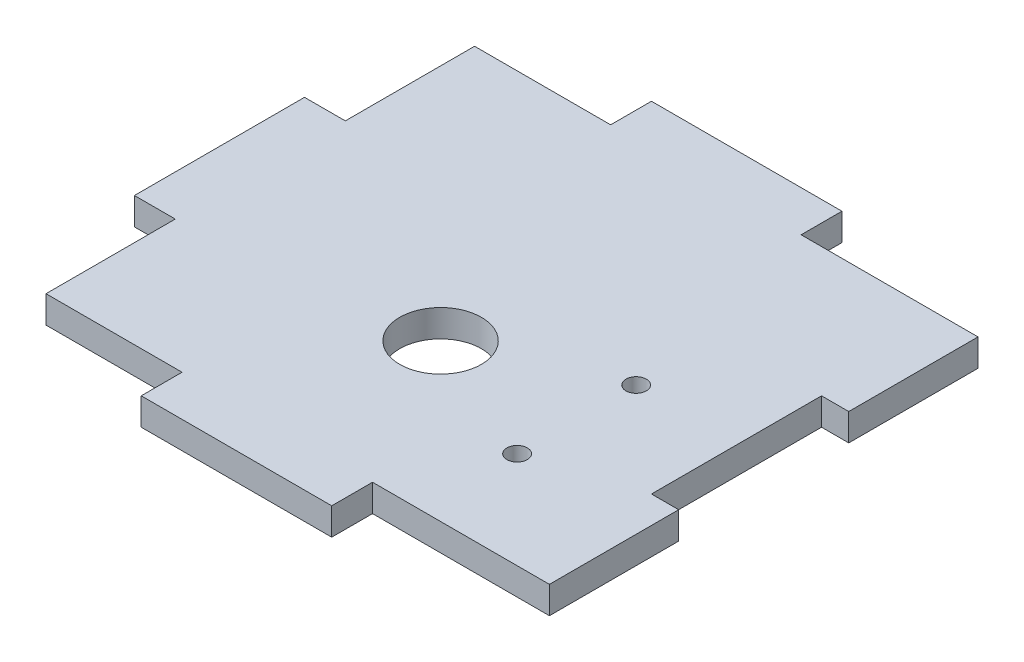
ISO-10303-21;
HEADER;
FILE_DESCRIPTION(('STEP AP214'),'2;1');
FILE_NAME('part.step','',(''),(''),'','','');
FILE_SCHEMA(('AUTOMOTIVE_DESIGN { 1 0 10303 214 1 1 1 1 }'));
ENDSEC;
DATA;
#1=APPLICATION_CONTEXT('core data for automotive mechanical design processes');
#2=APPLICATION_PROTOCOL_DEFINITION('international standard','automotive_design',2000,#1);
#3=PRODUCT_CONTEXT('',#1,'mechanical');
#4=PRODUCT('Part','Part','',(#3));
#5=PRODUCT_RELATED_PRODUCT_CATEGORY('part','',(#4));
#6=PRODUCT_DEFINITION_FORMATION('','',#4);
#7=PRODUCT_DEFINITION_CONTEXT('part definition',#1,'design');
#8=PRODUCT_DEFINITION('design','',#6,#7);
#9=PRODUCT_DEFINITION_SHAPE('','',#8);
#10=(LENGTH_UNIT() NAMED_UNIT(*) SI_UNIT(.MILLI.,.METRE.));
#11=(NAMED_UNIT(*) PLANE_ANGLE_UNIT() SI_UNIT($,.RADIAN.));
#12=(NAMED_UNIT(*) SI_UNIT($,.STERADIAN.) SOLID_ANGLE_UNIT());
#13=UNCERTAINTY_MEASURE_WITH_UNIT(LENGTH_MEASURE(1.E-05),#10,'distance_accuracy_value','');
#14=(GEOMETRIC_REPRESENTATION_CONTEXT(3) GLOBAL_UNCERTAINTY_ASSIGNED_CONTEXT((#13)) GLOBAL_UNIT_ASSIGNED_CONTEXT((#10,
#11,#12)) REPRESENTATION_CONTEXT('',''));
#15=CARTESIAN_POINT('',(0.,0.,0.));
#16=DIRECTION('',(0.,0.,1.));
#17=DIRECTION('',(1.,0.,0.));
#18=AXIS2_PLACEMENT_3D('',#15,#16,#17);
#19=CARTESIAN_POINT('',(0.,4.,0.));
#20=DIRECTION('',(1.,0.,0.));
#21=DIRECTION('',(0.,0.,-1.));
#22=AXIS2_PLACEMENT_3D('',#19,#20,#21);
#23=PLANE('',#22);
#24=DIRECTION('',(0.,1.,0.));
#25=VECTOR('',#24,1.);
#26=CARTESIAN_POINT('',(0.,0.,-25.));
#27=LINE('',#26,#25);
#28=CARTESIAN_POINT('',(0.,0.,-25.));
#29=VERTEX_POINT('',#28);
#30=CARTESIAN_POINT('',(0.,4.,-25.));
#31=VERTEX_POINT('',#30);
#32=EDGE_CURVE('E315',#29,#31,#27,.T.);
#33=ORIENTED_EDGE('',*,*,#32,.T.);
#34=DIRECTION('',(0.,0.,1.));
#35=VECTOR('',#34,1.);
#36=CARTESIAN_POINT('',(0.,4.,0.));
#37=LINE('',#36,#35);
#38=CARTESIAN_POINT('',(0.,4.,-50.));
#39=VERTEX_POINT('',#38);
#40=EDGE_CURVE('E235',#39,#31,#37,.T.);
#41=ORIENTED_EDGE('',*,*,#40,.F.);
#42=DIRECTION('',(0.,1.,0.));
#43=VECTOR('',#42,1.);
#44=CARTESIAN_POINT('',(0.,0.,-50.));
#45=LINE('',#44,#43);
#46=CARTESIAN_POINT('',(0.,0.,-50.));
#47=VERTEX_POINT('',#46);
#48=EDGE_CURVE('E374',#47,#39,#45,.T.);
#49=ORIENTED_EDGE('',*,*,#48,.F.);
#50=DIRECTION('',(0.,0.,1.));
#51=VECTOR('',#50,1.);
#52=CARTESIAN_POINT('',(0.,0.,0.));
#53=LINE('',#52,#51);
#54=EDGE_CURVE('E216',#47,#29,#53,.T.);
#55=ORIENTED_EDGE('',*,*,#54,.T.);
#56=EDGE_LOOP('',(#33,#41,#49,#55));
#57=FACE_BOUND('',#56,.T.);
#58=ADVANCED_FACE('F39',(#57),#23,.F.);
#59=CARTESIAN_POINT('',(0.,4.,0.));
#60=DIRECTION('',(0.,0.,-1.));
#61=DIRECTION('',(-1.,0.,0.));
#62=AXIS2_PLACEMENT_3D('',#59,#60,#61);
#63=PLANE('',#62);
#64=DIRECTION('',(1.,0.,0.));
#65=VECTOR('',#64,1.);
#66=CARTESIAN_POINT('',(0.,4.,0.));
#67=LINE('',#66,#65);
#68=CARTESIAN_POINT('',(26.,4.,0.));
#69=VERTEX_POINT('',#68);
#70=CARTESIAN_POINT('',(54.,4.,0.));
#71=VERTEX_POINT('',#70);
#72=EDGE_CURVE('E212',#69,#71,#67,.T.);
#73=ORIENTED_EDGE('',*,*,#72,.F.);
#74=DIRECTION('',(0.,1.,0.));
#75=VECTOR('',#74,1.);
#76=CARTESIAN_POINT('',(26.,0.,0.));
#77=LINE('',#76,#75);
#78=CARTESIAN_POINT('',(26.,0.,0.));
#79=VERTEX_POINT('',#78);
#80=EDGE_CURVE('E355',#79,#69,#77,.T.);
#81=ORIENTED_EDGE('',*,*,#80,.F.);
#82=DIRECTION('',(1.,0.,0.));
#83=VECTOR('',#82,1.);
#84=CARTESIAN_POINT('',(0.,0.,0.));
#85=LINE('',#84,#83);
#86=CARTESIAN_POINT('',(54.,0.,0.));
#87=VERTEX_POINT('',#86);
#88=EDGE_CURVE('E220',#79,#87,#85,.T.);
#89=ORIENTED_EDGE('',*,*,#88,.T.);
#90=DIRECTION('',(0.,1.,0.));
#91=VECTOR('',#90,1.);
#92=CARTESIAN_POINT('',(54.,0.,0.));
#93=LINE('',#92,#91);
#94=EDGE_CURVE('E192',#87,#71,#93,.T.);
#95=ORIENTED_EDGE('',*,*,#94,.T.);
#96=EDGE_LOOP('',(#73,#81,#89,#95));
#97=FACE_BOUND('',#96,.T.);
#98=ADVANCED_FACE('F489',(#97),#63,.F.);
#99=CARTESIAN_POINT('',(80.,4.,0.));
#100=DIRECTION('',(-1.,0.,0.));
#101=DIRECTION('',(0.,0.,1.));
#102=AXIS2_PLACEMENT_3D('',#99,#100,#101);
#103=PLANE('',#102);
#104=DIRECTION('',(0.,1.,0.));
#105=VECTOR('',#104,1.);
#106=CARTESIAN_POINT('',(80.,0.,-69.));
#107=LINE('',#106,#105);
#108=CARTESIAN_POINT('',(80.,0.,-69.));
#109=VERTEX_POINT('',#108);
#110=CARTESIAN_POINT('',(80.,4.,-69.));
#111=VERTEX_POINT('',#110);
#112=EDGE_CURVE('E310',#109,#111,#107,.T.);
#113=ORIENTED_EDGE('',*,*,#112,.T.);
#114=DIRECTION('',(0.,0.,-1.));
#115=VECTOR('',#114,1.);
#116=CARTESIAN_POINT('',(80.,4.,0.));
#117=LINE('',#116,#115);
#118=CARTESIAN_POINT('',(80.,4.,-50.));
#119=VERTEX_POINT('',#118);
#120=EDGE_CURVE('E208',#119,#111,#117,.T.);
#121=ORIENTED_EDGE('',*,*,#120,.F.);
#122=DIRECTION('',(0.,1.,0.));
#123=VECTOR('',#122,1.);
#124=CARTESIAN_POINT('',(80.,0.,-50.));
#125=LINE('',#124,#123);
#126=CARTESIAN_POINT('',(80.,0.,-50.));
#127=VERTEX_POINT('',#126);
#128=EDGE_CURVE('E276',#127,#119,#125,.T.);
#129=ORIENTED_EDGE('',*,*,#128,.F.);
#130=DIRECTION('',(0.,0.,-1.));
#131=VECTOR('',#130,1.);
#132=CARTESIAN_POINT('',(80.,0.,0.));
#133=LINE('',#132,#131);
#134=EDGE_CURVE('E224',#127,#109,#133,.T.);
#135=ORIENTED_EDGE('',*,*,#134,.T.);
#136=EDGE_LOOP('',(#113,#121,#129,#135));
#137=FACE_BOUND('',#136,.T.);
#138=ADVANCED_FACE('F441',(#137),#103,.F.);
#139=CARTESIAN_POINT('',(80.,4.,-6.00000000000001));
#140=VERTEX_POINT('',#139);
#141=CARTESIAN_POINT('',(80.,4.,-25.));
#142=VERTEX_POINT('',#141);
#143=EDGE_CURVE('E48',#140,#142,#117,.T.);
#144=ORIENTED_EDGE('',*,*,#143,.F.);
#145=DIRECTION('',(0.,1.,0.));
#146=VECTOR('',#145,1.);
#147=CARTESIAN_POINT('',(80.,0.,-6.00000000000001));
#148=LINE('',#147,#146);
#149=CARTESIAN_POINT('',(80.,0.,-6.00000000000001));
#150=VERTEX_POINT('',#149);
#151=EDGE_CURVE('E179',#150,#140,#148,.T.);
#152=ORIENTED_EDGE('',*,*,#151,.F.);
#153=CARTESIAN_POINT('',(80.,0.,-25.));
#154=VERTEX_POINT('',#153);
#155=EDGE_CURVE('E227',#150,#154,#133,.T.);
#156=ORIENTED_EDGE('',*,*,#155,.T.);
#157=DIRECTION('',(0.,1.,0.));
#158=VECTOR('',#157,1.);
#159=CARTESIAN_POINT('',(80.,0.,-25.));
#160=LINE('',#159,#158);
#161=EDGE_CURVE('E206',#154,#142,#160,.T.);
#162=ORIENTED_EDGE('',*,*,#161,.T.);
#163=EDGE_LOOP('',(#144,#152,#156,#162));
#164=FACE_BOUND('',#163,.T.);
#165=ADVANCED_FACE('F205',(#164),#103,.F.);
#166=CARTESIAN_POINT('',(0.,4.,-75.));
#167=DIRECTION('',(0.,0.,1.));
#168=DIRECTION('',(1.,0.,0.));
#169=AXIS2_PLACEMENT_3D('',#166,#167,#168);
#170=PLANE('',#169);
#171=DIRECTION('',(-1.,0.,0.));
#172=VECTOR('',#171,1.);
#173=CARTESIAN_POINT('',(0.,4.,-75.));
#174=LINE('',#173,#172);
#175=CARTESIAN_POINT('',(54.,4.,-75.));
#176=VERTEX_POINT('',#175);
#177=CARTESIAN_POINT('',(26.,4.,-75.));
#178=VERTEX_POINT('',#177);
#179=EDGE_CURVE('E11',#176,#178,#174,.T.);
#180=ORIENTED_EDGE('',*,*,#179,.F.);
#181=DIRECTION('',(0.,1.,0.));
#182=VECTOR('',#181,1.);
#183=CARTESIAN_POINT('',(54.,0.,-75.));
#184=LINE('',#183,#182);
#185=CARTESIAN_POINT('',(54.,0.,-75.));
#186=VERTEX_POINT('',#185);
#187=EDGE_CURVE('E320',#186,#176,#184,.T.);
#188=ORIENTED_EDGE('',*,*,#187,.F.);
#189=DIRECTION('',(-1.,0.,0.));
#190=VECTOR('',#189,1.);
#191=CARTESIAN_POINT('',(0.,0.,-75.));
#192=LINE('',#191,#190);
#193=CARTESIAN_POINT('',(26.,0.,-75.));
#194=VERTEX_POINT('',#193);
#195=EDGE_CURVE('E42',#186,#194,#192,.T.);
#196=ORIENTED_EDGE('',*,*,#195,.T.);
#197=DIRECTION('',(0.,1.,0.));
#198=VECTOR('',#197,1.);
#199=CARTESIAN_POINT('',(26.,0.,-75.));
#200=LINE('',#199,#198);
#201=EDGE_CURVE('E379',#194,#178,#200,.T.);
#202=ORIENTED_EDGE('',*,*,#201,.T.);
#203=EDGE_LOOP('',(#180,#188,#196,#202));
#204=FACE_BOUND('',#203,.T.);
#205=ADVANCED_FACE('F449',(#204),#170,.F.);
#206=CARTESIAN_POINT('',(0.,4.,0.));
#207=DIRECTION('',(0.,-1.,0.));
#208=DIRECTION('',(0.,0.,-1.));
#209=AXIS2_PLACEMENT_3D('',#206,#207,#208);
#210=PLANE('',#209);
#211=CARTESIAN_POINT('',(41.,4.,-29.));
#212=DIRECTION('',(0.,1.,0.));
#213=DIRECTION('',(0.,0.,1.));
#214=AXIS2_PLACEMENT_3D('',#211,#212,#213);
#215=CIRCLE('',#214,6.);
#216=CARTESIAN_POINT('',(41.,4.,-23.));
#217=VERTEX_POINT('',#216);
#218=EDGE_CURVE('E263',#217,#217,#215,.T.);
#219=ORIENTED_EDGE('',*,*,#218,.F.);
#220=EDGE_LOOP('',(#219));
#221=FACE_BOUND('',#220,.T.);
#222=CARTESIAN_POINT('',(61.,4.,-37.75));
#223=DIRECTION('',(0.,1.,0.));
#224=DIRECTION('',(0.,0.,1.));
#225=AXIS2_PLACEMENT_3D('',#222,#223,#224);
#226=CIRCLE('',#225,1.5);
#227=CARTESIAN_POINT('',(61.,4.,-36.25));
#228=VERTEX_POINT('',#227);
#229=EDGE_CURVE('E255',#228,#228,#226,.T.);
#230=ORIENTED_EDGE('',*,*,#229,.F.);
#231=EDGE_LOOP('',(#230));
#232=FACE_BOUND('',#231,.T.);
#233=CARTESIAN_POINT('',(61.,4.,-20.25));
#234=DIRECTION('',(0.,1.,0.));
#235=DIRECTION('',(0.,0.,1.));
#236=AXIS2_PLACEMENT_3D('',#233,#234,#235);
#237=CIRCLE('',#236,1.5);
#238=CARTESIAN_POINT('',(61.,4.,-18.75));
#239=VERTEX_POINT('',#238);
#240=EDGE_CURVE('E246',#239,#239,#237,.T.);
#241=ORIENTED_EDGE('',*,*,#240,.F.);
#242=EDGE_LOOP('',(#241));
#243=FACE_BOUND('',#242,.T.);
#244=DIRECTION('',(1.,0.,0.));
#245=VECTOR('',#244,1.);
#246=CARTESIAN_POINT('',(0.,4.,-25.));
#247=LINE('',#246,#245);
#248=CARTESIAN_POINT('',(6.00000000000001,4.,-25.));
#249=VERTEX_POINT('',#248);
#250=EDGE_CURVE('E327',#31,#249,#247,.T.);
#251=ORIENTED_EDGE('',*,*,#250,.T.);
#252=DIRECTION('',(0.,0.,1.));
#253=VECTOR('',#252,1.);
#254=CARTESIAN_POINT('',(6.00000000000001,4.,0.));
#255=LINE('',#254,#253);
#256=CARTESIAN_POINT('',(6.00000000000001,4.,-6.));
#257=VERTEX_POINT('',#256);
#258=EDGE_CURVE('E332',#249,#257,#255,.T.);
#259=ORIENTED_EDGE('',*,*,#258,.T.);
#260=DIRECTION('',(1.,0.,0.));
#261=VECTOR('',#260,1.);
#262=CARTESIAN_POINT('',(0.,4.,-6.));
#263=LINE('',#262,#261);
#264=CARTESIAN_POINT('',(26.,4.,-6.));
#265=VERTEX_POINT('',#264);
#266=EDGE_CURVE('E293',#257,#265,#263,.T.);
#267=ORIENTED_EDGE('',*,*,#266,.T.);
#268=DIRECTION('',(0.,0.,-1.));
#269=VECTOR('',#268,1.);
#270=CARTESIAN_POINT('',(26.,4.,0.));
#271=LINE('',#270,#269);
#272=EDGE_CURVE('E350',#69,#265,#271,.T.);
#273=ORIENTED_EDGE('',*,*,#272,.F.);
#274=ORIENTED_EDGE('',*,*,#72,.T.);
#275=DIRECTION('',(0.,0.,-1.));
#276=VECTOR('',#275,1.);
#277=CARTESIAN_POINT('',(54.,4.,0.));
#278=LINE('',#277,#276);
#279=CARTESIAN_POINT('',(54.,4.,-6.00000000000001));
#280=VERTEX_POINT('',#279);
#281=EDGE_CURVE('E201',#71,#280,#278,.T.);
#282=ORIENTED_EDGE('',*,*,#281,.T.);
#283=DIRECTION('',(-1.,0.,0.));
#284=VECTOR('',#283,1.);
#285=CARTESIAN_POINT('',(80.,4.,-6.00000000000001));
#286=LINE('',#285,#284);
#287=EDGE_CURVE('E183',#140,#280,#286,.T.);
#288=ORIENTED_EDGE('',*,*,#287,.F.);
#289=ORIENTED_EDGE('',*,*,#143,.T.);
#290=DIRECTION('',(-1.,0.,0.));
#291=VECTOR('',#290,1.);
#292=CARTESIAN_POINT('',(0.,4.,-25.));
#293=LINE('',#292,#291);
#294=CARTESIAN_POINT('',(76.,4.,-25.));
#295=VERTEX_POINT('',#294);
#296=EDGE_CURVE('E286',#142,#295,#293,.T.);
#297=ORIENTED_EDGE('',*,*,#296,.T.);
#298=DIRECTION('',(0.,0.,-1.));
#299=VECTOR('',#298,1.);
#300=CARTESIAN_POINT('',(76.,4.,0.));
#301=LINE('',#300,#299);
#302=CARTESIAN_POINT('',(76.,4.,-50.));
#303=VERTEX_POINT('',#302);
#304=EDGE_CURVE('E289',#295,#303,#301,.T.);
#305=ORIENTED_EDGE('',*,*,#304,.T.);
#306=DIRECTION('',(-1.,0.,0.));
#307=VECTOR('',#306,1.);
#308=CARTESIAN_POINT('',(0.,4.,-50.));
#309=LINE('',#308,#307);
#310=EDGE_CURVE('E281',#119,#303,#309,.T.);
#311=ORIENTED_EDGE('',*,*,#310,.F.);
#312=ORIENTED_EDGE('',*,*,#120,.T.);
#313=DIRECTION('',(-1.,0.,0.));
#314=VECTOR('',#313,1.);
#315=CARTESIAN_POINT('',(80.,4.,-69.));
#316=LINE('',#315,#314);
#317=CARTESIAN_POINT('',(54.,4.,-69.));
#318=VERTEX_POINT('',#317);
#319=EDGE_CURVE('E311',#111,#318,#316,.T.);
#320=ORIENTED_EDGE('',*,*,#319,.T.);
#321=DIRECTION('',(0.,0.,1.));
#322=VECTOR('',#321,1.);
#323=CARTESIAN_POINT('',(54.,4.,-75.));
#324=LINE('',#323,#322);
#325=EDGE_CURVE('E305',#176,#318,#324,.T.);
#326=ORIENTED_EDGE('',*,*,#325,.F.);
#327=ORIENTED_EDGE('',*,*,#179,.T.);
#328=DIRECTION('',(0.,0.,1.));
#329=VECTOR('',#328,1.);
#330=CARTESIAN_POINT('',(26.,4.,-75.));
#331=LINE('',#330,#329);
#332=CARTESIAN_POINT('',(26.,4.,-69.));
#333=VERTEX_POINT('',#332);
#334=EDGE_CURVE('E395',#178,#333,#331,.T.);
#335=ORIENTED_EDGE('',*,*,#334,.T.);
#336=DIRECTION('',(1.,0.,0.));
#337=VECTOR('',#336,1.);
#338=CARTESIAN_POINT('',(0.,4.,-69.));
#339=LINE('',#338,#337);
#340=CARTESIAN_POINT('',(6.,4.,-69.));
#341=VERTEX_POINT('',#340);
#342=EDGE_CURVE('E193',#341,#333,#339,.T.);
#343=ORIENTED_EDGE('',*,*,#342,.F.);
#344=DIRECTION('',(0.,0.,1.));
#345=VECTOR('',#344,1.);
#346=CARTESIAN_POINT('',(6.00000000000001,4.,0.));
#347=LINE('',#346,#345);
#348=CARTESIAN_POINT('',(6.,4.,-50.));
#349=VERTEX_POINT('',#348);
#350=EDGE_CURVE('E370',#341,#349,#347,.T.);
#351=ORIENTED_EDGE('',*,*,#350,.T.);
#352=DIRECTION('',(1.,0.,0.));
#353=VECTOR('',#352,1.);
#354=CARTESIAN_POINT('',(0.,4.,-50.));
#355=LINE('',#354,#353);
#356=EDGE_CURVE('E375',#39,#349,#355,.T.);
#357=ORIENTED_EDGE('',*,*,#356,.F.);
#358=ORIENTED_EDGE('',*,*,#40,.T.);
#359=EDGE_LOOP('',(#251,#259,#267,#273,#274,#282,#288,#289,#297,#305,#311,#312,#320,#326,#327,
#335,#343,#351,#357,#358));
#360=FACE_BOUND('',#359,.T.);
#361=ADVANCED_FACE('F198',(#221,#232,#243,#360),#210,.F.);
#362=CARTESIAN_POINT('',(0.,0.,0.));
#363=DIRECTION('',(0.,-1.,0.));
#364=DIRECTION('',(0.,0.,-1.));
#365=AXIS2_PLACEMENT_3D('',#362,#363,#364);
#366=PLANE('',#365);
#367=CARTESIAN_POINT('',(41.,0.,-29.));
#368=DIRECTION('',(0.,1.,0.));
#369=DIRECTION('',(0.,0.,1.));
#370=AXIS2_PLACEMENT_3D('',#367,#368,#369);
#371=CIRCLE('',#370,6.);
#372=CARTESIAN_POINT('',(41.,0.,-23.));
#373=VERTEX_POINT('',#372);
#374=EDGE_CURVE('E221',#373,#373,#371,.T.);
#375=ORIENTED_EDGE('',*,*,#374,.T.);
#376=EDGE_LOOP('',(#375));
#377=FACE_BOUND('',#376,.T.);
#378=CARTESIAN_POINT('',(61.,0.,-37.75));
#379=DIRECTION('',(0.,1.,0.));
#380=DIRECTION('',(0.,0.,1.));
#381=AXIS2_PLACEMENT_3D('',#378,#379,#380);
#382=CIRCLE('',#381,1.5);
#383=CARTESIAN_POINT('',(61.,0.,-36.25));
#384=VERTEX_POINT('',#383);
#385=EDGE_CURVE('E259',#384,#384,#382,.T.);
#386=ORIENTED_EDGE('',*,*,#385,.T.);
#387=EDGE_LOOP('',(#386));
#388=FACE_BOUND('',#387,.T.);
#389=CARTESIAN_POINT('',(61.,0.,-20.25));
#390=DIRECTION('',(0.,1.,0.));
#391=DIRECTION('',(0.,0.,1.));
#392=AXIS2_PLACEMENT_3D('',#389,#390,#391);
#393=CIRCLE('',#392,1.5);
#394=CARTESIAN_POINT('',(61.,0.,-18.75));
#395=VERTEX_POINT('',#394);
#396=EDGE_CURVE('E250',#395,#395,#393,.T.);
#397=ORIENTED_EDGE('',*,*,#396,.T.);
#398=EDGE_LOOP('',(#397));
#399=FACE_BOUND('',#398,.T.);
#400=DIRECTION('',(0.,0.,1.));
#401=VECTOR('',#400,1.);
#402=CARTESIAN_POINT('',(6.00000000000001,0.,0.));
#403=LINE('',#402,#401);
#404=CARTESIAN_POINT('',(6.00000000000001,0.,-25.));
#405=VERTEX_POINT('',#404);
#406=CARTESIAN_POINT('',(6.00000000000001,0.,-6.));
#407=VERTEX_POINT('',#406);
#408=EDGE_CURVE('E56',#405,#407,#403,.T.);
#409=ORIENTED_EDGE('',*,*,#408,.F.);
#410=DIRECTION('',(1.,0.,0.));
#411=VECTOR('',#410,1.);
#412=CARTESIAN_POINT('',(0.,0.,-25.));
#413=LINE('',#412,#411);
#414=EDGE_CURVE('E328',#29,#405,#413,.T.);
#415=ORIENTED_EDGE('',*,*,#414,.F.);
#416=ORIENTED_EDGE('',*,*,#54,.F.);
#417=DIRECTION('',(1.,0.,0.));
#418=VECTOR('',#417,1.);
#419=CARTESIAN_POINT('',(0.,0.,-50.));
#420=LINE('',#419,#418);
#421=CARTESIAN_POINT('',(6.,0.,-50.));
#422=VERTEX_POINT('',#421);
#423=EDGE_CURVE('E366',#47,#422,#420,.T.);
#424=ORIENTED_EDGE('',*,*,#423,.T.);
#425=DIRECTION('',(0.,0.,1.));
#426=VECTOR('',#425,1.);
#427=CARTESIAN_POINT('',(6.00000000000001,0.,0.));
#428=LINE('',#427,#426);
#429=CARTESIAN_POINT('',(6.,0.,-69.));
#430=VERTEX_POINT('',#429);
#431=EDGE_CURVE('E371',#430,#422,#428,.T.);
#432=ORIENTED_EDGE('',*,*,#431,.F.);
#433=DIRECTION('',(1.,0.,0.));
#434=VECTOR('',#433,1.);
#435=CARTESIAN_POINT('',(0.,0.,-69.));
#436=LINE('',#435,#434);
#437=CARTESIAN_POINT('',(26.,0.,-69.));
#438=VERTEX_POINT('',#437);
#439=EDGE_CURVE('E391',#430,#438,#436,.T.);
#440=ORIENTED_EDGE('',*,*,#439,.T.);
#441=DIRECTION('',(0.,0.,1.));
#442=VECTOR('',#441,1.);
#443=CARTESIAN_POINT('',(26.,0.,-75.));
#444=LINE('',#443,#442);
#445=EDGE_CURVE('E396',#194,#438,#444,.T.);
#446=ORIENTED_EDGE('',*,*,#445,.F.);
#447=ORIENTED_EDGE('',*,*,#195,.F.);
#448=DIRECTION('',(0.,0.,1.));
#449=VECTOR('',#448,1.);
#450=CARTESIAN_POINT('',(54.,0.,-75.));
#451=LINE('',#450,#449);
#452=CARTESIAN_POINT('',(54.,0.,-69.));
#453=VERTEX_POINT('',#452);
#454=EDGE_CURVE('E306',#186,#453,#451,.T.);
#455=ORIENTED_EDGE('',*,*,#454,.T.);
#456=DIRECTION('',(-1.,0.,0.));
#457=VECTOR('',#456,1.);
#458=CARTESIAN_POINT('',(80.,0.,-69.));
#459=LINE('',#458,#457);
#460=EDGE_CURVE('E302',#109,#453,#459,.T.);
#461=ORIENTED_EDGE('',*,*,#460,.F.);
#462=ORIENTED_EDGE('',*,*,#134,.F.);
#463=DIRECTION('',(-1.,0.,0.));
#464=VECTOR('',#463,1.);
#465=CARTESIAN_POINT('',(0.,0.,-50.));
#466=LINE('',#465,#464);
#467=CARTESIAN_POINT('',(76.,0.,-50.));
#468=VERTEX_POINT('',#467);
#469=EDGE_CURVE('E273',#127,#468,#466,.T.);
#470=ORIENTED_EDGE('',*,*,#469,.T.);
#471=DIRECTION('',(0.,0.,-1.));
#472=VECTOR('',#471,1.);
#473=CARTESIAN_POINT('',(76.,0.,0.));
#474=LINE('',#473,#472);
#475=CARTESIAN_POINT('',(76.,0.,-25.));
#476=VERTEX_POINT('',#475);
#477=EDGE_CURVE('E285',#476,#468,#474,.T.);
#478=ORIENTED_EDGE('',*,*,#477,.F.);
#479=DIRECTION('',(-1.,0.,0.));
#480=VECTOR('',#479,1.);
#481=CARTESIAN_POINT('',(0.,0.,-25.));
#482=LINE('',#481,#480);
#483=EDGE_CURVE('E297',#154,#476,#482,.T.);
#484=ORIENTED_EDGE('',*,*,#483,.F.);
#485=ORIENTED_EDGE('',*,*,#155,.F.);
#486=DIRECTION('',(-1.,0.,0.));
#487=VECTOR('',#486,1.);
#488=CARTESIAN_POINT('',(80.,0.,-6.00000000000001));
#489=LINE('',#488,#487);
#490=CARTESIAN_POINT('',(54.,0.,-6.00000000000001));
#491=VERTEX_POINT('',#490);
#492=EDGE_CURVE('E186',#150,#491,#489,.T.);
#493=ORIENTED_EDGE('',*,*,#492,.T.);
#494=DIRECTION('',(0.,0.,-1.));
#495=VECTOR('',#494,1.);
#496=CARTESIAN_POINT('',(54.,0.,0.));
#497=LINE('',#496,#495);
#498=EDGE_CURVE('E413',#87,#491,#497,.T.);
#499=ORIENTED_EDGE('',*,*,#498,.F.);
#500=ORIENTED_EDGE('',*,*,#88,.F.);
#501=DIRECTION('',(0.,0.,-1.));
#502=VECTOR('',#501,1.);
#503=CARTESIAN_POINT('',(26.,0.,0.));
#504=LINE('',#503,#502);
#505=CARTESIAN_POINT('',(26.,0.,-6.));
#506=VERTEX_POINT('',#505);
#507=EDGE_CURVE('E351',#79,#506,#504,.T.);
#508=ORIENTED_EDGE('',*,*,#507,.T.);
#509=DIRECTION('',(1.,0.,0.));
#510=VECTOR('',#509,1.);
#511=CARTESIAN_POINT('',(0.,0.,-6.));
#512=LINE('',#511,#510);
#513=EDGE_CURVE('E347',#407,#506,#512,.T.);
#514=ORIENTED_EDGE('',*,*,#513,.F.);
#515=EDGE_LOOP('',(#409,#415,#416,#424,#432,#440,#446,#447,#455,#461,#462,#470,#478,#484,#485,
#493,#499,#500,#508,#514));
#516=FACE_BOUND('',#515,.T.);
#517=ADVANCED_FACE('F427',(#377,#388,#399,#516),#366,.T.);
#518=CARTESIAN_POINT('',(61.,0.,-20.25));
#519=DIRECTION('',(0.,1.,0.));
#520=DIRECTION('',(0.,0.,1.));
#521=AXIS2_PLACEMENT_3D('',#518,#519,#520);
#522=CYLINDRICAL_SURFACE('',#521,1.5);
#523=ORIENTED_EDGE('',*,*,#396,.F.);
#524=EDGE_LOOP('',(#523));
#525=FACE_BOUND('',#524,.T.);
#526=ORIENTED_EDGE('',*,*,#240,.T.);
#527=EDGE_LOOP('',(#526));
#528=FACE_BOUND('',#527,.T.);
#529=ADVANCED_FACE('F503',(#525,#528),#522,.F.);
#530=CARTESIAN_POINT('',(61.,0.,-37.75));
#531=DIRECTION('',(0.,1.,0.));
#532=DIRECTION('',(0.,0.,1.));
#533=AXIS2_PLACEMENT_3D('',#530,#531,#532);
#534=CYLINDRICAL_SURFACE('',#533,1.5);
#535=ORIENTED_EDGE('',*,*,#385,.F.);
#536=EDGE_LOOP('',(#535));
#537=FACE_BOUND('',#536,.T.);
#538=ORIENTED_EDGE('',*,*,#229,.T.);
#539=EDGE_LOOP('',(#538));
#540=FACE_BOUND('',#539,.T.);
#541=ADVANCED_FACE('F510',(#537,#540),#534,.F.);
#542=CARTESIAN_POINT('',(41.,0.,-29.));
#543=DIRECTION('',(0.,1.,0.));
#544=DIRECTION('',(0.,0.,1.));
#545=AXIS2_PLACEMENT_3D('',#542,#543,#544);
#546=CYLINDRICAL_SURFACE('',#545,6.);
#547=ORIENTED_EDGE('',*,*,#374,.F.);
#548=EDGE_LOOP('',(#547));
#549=FACE_BOUND('',#548,.T.);
#550=ORIENTED_EDGE('',*,*,#218,.T.);
#551=EDGE_LOOP('',(#550));
#552=FACE_BOUND('',#551,.T.);
#553=ADVANCED_FACE('F514',(#549,#552),#546,.F.);
#554=CARTESIAN_POINT('',(76.,0.,0.));
#555=DIRECTION('',(1.,0.,0.));
#556=DIRECTION('',(0.,0.,-1.));
#557=AXIS2_PLACEMENT_3D('',#554,#555,#556);
#558=PLANE('',#557);
#559=ORIENTED_EDGE('',*,*,#304,.F.);
#560=DIRECTION('',(0.,1.,0.));
#561=VECTOR('',#560,1.);
#562=CARTESIAN_POINT('',(76.,0.,-25.));
#563=LINE('',#562,#561);
#564=EDGE_CURVE('E270',#476,#295,#563,.T.);
#565=ORIENTED_EDGE('',*,*,#564,.F.);
#566=ORIENTED_EDGE('',*,*,#477,.T.);
#567=DIRECTION('',(0.,1.,0.));
#568=VECTOR('',#567,1.);
#569=CARTESIAN_POINT('',(76.,0.,-50.));
#570=LINE('',#569,#568);
#571=EDGE_CURVE('E251',#468,#303,#570,.T.);
#572=ORIENTED_EDGE('',*,*,#571,.T.);
#573=EDGE_LOOP('',(#559,#565,#566,#572));
#574=FACE_BOUND('',#573,.T.);
#575=ADVANCED_FACE('F436',(#574),#558,.T.);
#576=CARTESIAN_POINT('',(0.,0.,-50.));
#577=DIRECTION('',(0.,0.,-1.));
#578=DIRECTION('',(-1.,0.,0.));
#579=AXIS2_PLACEMENT_3D('',#576,#577,#578);
#580=PLANE('',#579);
#581=ORIENTED_EDGE('',*,*,#310,.T.);
#582=ORIENTED_EDGE('',*,*,#571,.F.);
#583=ORIENTED_EDGE('',*,*,#469,.F.);
#584=ORIENTED_EDGE('',*,*,#128,.T.);
#585=EDGE_LOOP('',(#581,#582,#583,#584));
#586=FACE_BOUND('',#585,.T.);
#587=ADVANCED_FACE('F521',(#586),#580,.F.);
#588=CARTESIAN_POINT('',(0.,0.,-25.));
#589=DIRECTION('',(0.,0.,-1.));
#590=DIRECTION('',(-1.,0.,0.));
#591=AXIS2_PLACEMENT_3D('',#588,#589,#590);
#592=PLANE('',#591);
#593=ORIENTED_EDGE('',*,*,#296,.F.);
#594=ORIENTED_EDGE('',*,*,#161,.F.);
#595=ORIENTED_EDGE('',*,*,#483,.T.);
#596=ORIENTED_EDGE('',*,*,#564,.T.);
#597=EDGE_LOOP('',(#593,#594,#595,#596));
#598=FACE_BOUND('',#597,.T.);
#599=ADVANCED_FACE('F433',(#598),#592,.T.);
#600=CARTESIAN_POINT('',(0.,0.,-50.));
#601=DIRECTION('',(0.,0.,1.));
#602=DIRECTION('',(1.,0.,0.));
#603=AXIS2_PLACEMENT_3D('',#600,#601,#602);
#604=PLANE('',#603);
#605=ORIENTED_EDGE('',*,*,#356,.T.);
#606=DIRECTION('',(0.,1.,0.));
#607=VECTOR('',#606,1.);
#608=CARTESIAN_POINT('',(6.,0.,-50.));
#609=LINE('',#608,#607);
#610=EDGE_CURVE('E386',#422,#349,#609,.T.);
#611=ORIENTED_EDGE('',*,*,#610,.F.);
#612=ORIENTED_EDGE('',*,*,#423,.F.);
#613=ORIENTED_EDGE('',*,*,#48,.T.);
#614=EDGE_LOOP('',(#605,#611,#612,#613));
#615=FACE_BOUND('',#614,.T.);
#616=ADVANCED_FACE('F524',(#615),#604,.F.);
#617=CARTESIAN_POINT('',(6.00000000000001,0.,0.));
#618=DIRECTION('',(-1.,0.,0.));
#619=DIRECTION('',(0.,0.,1.));
#620=AXIS2_PLACEMENT_3D('',#617,#618,#619);
#621=PLANE('',#620);
#622=ORIENTED_EDGE('',*,*,#350,.F.);
#623=DIRECTION('',(0.,1.,0.));
#624=VECTOR('',#623,1.);
#625=CARTESIAN_POINT('',(6.,0.,-69.));
#626=LINE('',#625,#624);
#627=EDGE_CURVE('E383',#430,#341,#626,.T.);
#628=ORIENTED_EDGE('',*,*,#627,.F.);
#629=ORIENTED_EDGE('',*,*,#431,.T.);
#630=ORIENTED_EDGE('',*,*,#610,.T.);
#631=EDGE_LOOP('',(#622,#628,#629,#630));
#632=FACE_BOUND('',#631,.T.);
#633=ADVANCED_FACE('F459',(#632),#621,.T.);
#634=CARTESIAN_POINT('',(26.,0.,-75.));
#635=DIRECTION('',(-1.,0.,0.));
#636=DIRECTION('',(0.,0.,1.));
#637=AXIS2_PLACEMENT_3D('',#634,#635,#636);
#638=PLANE('',#637);
#639=ORIENTED_EDGE('',*,*,#334,.F.);
#640=ORIENTED_EDGE('',*,*,#201,.F.);
#641=ORIENTED_EDGE('',*,*,#445,.T.);
#642=DIRECTION('',(0.,1.,0.));
#643=VECTOR('',#642,1.);
#644=CARTESIAN_POINT('',(26.,0.,-69.));
#645=LINE('',#644,#643);
#646=EDGE_CURVE('E400',#438,#333,#645,.T.);
#647=ORIENTED_EDGE('',*,*,#646,.T.);
#648=EDGE_LOOP('',(#639,#640,#641,#647));
#649=FACE_BOUND('',#648,.T.);
#650=ADVANCED_FACE('F452',(#649),#638,.T.);
#651=CARTESIAN_POINT('',(0.,0.,-69.));
#652=DIRECTION('',(0.,0.,1.));
#653=DIRECTION('',(1.,0.,0.));
#654=AXIS2_PLACEMENT_3D('',#651,#652,#653);
#655=PLANE('',#654);
#656=ORIENTED_EDGE('',*,*,#627,.T.);
#657=ORIENTED_EDGE('',*,*,#342,.T.);
#658=ORIENTED_EDGE('',*,*,#646,.F.);
#659=ORIENTED_EDGE('',*,*,#439,.F.);
#660=EDGE_LOOP('',(#656,#657,#658,#659));
#661=FACE_BOUND('',#660,.T.);
#662=ADVANCED_FACE('F455',(#661),#655,.F.);
#663=CARTESIAN_POINT('',(80.,0.,-6.00000000000001));
#664=DIRECTION('',(0.,0.,-1.));
#665=DIRECTION('',(-1.,0.,0.));
#666=AXIS2_PLACEMENT_3D('',#663,#664,#665);
#667=PLANE('',#666);
#668=ORIENTED_EDGE('',*,*,#287,.T.);
#669=DIRECTION('',(0.,1.,0.));
#670=VECTOR('',#669,1.);
#671=CARTESIAN_POINT('',(54.,0.,-6.00000000000001));
#672=LINE('',#671,#670);
#673=EDGE_CURVE('E415',#491,#280,#672,.T.);
#674=ORIENTED_EDGE('',*,*,#673,.F.);
#675=ORIENTED_EDGE('',*,*,#492,.F.);
#676=ORIENTED_EDGE('',*,*,#151,.T.);
#677=EDGE_LOOP('',(#668,#674,#675,#676));
#678=FACE_BOUND('',#677,.T.);
#679=ADVANCED_FACE('F181',(#678),#667,.F.);
#680=CARTESIAN_POINT('',(54.,0.,0.));
#681=DIRECTION('',(1.,0.,0.));
#682=DIRECTION('',(0.,0.,-1.));
#683=AXIS2_PLACEMENT_3D('',#680,#681,#682);
#684=PLANE('',#683);
#685=ORIENTED_EDGE('',*,*,#281,.F.);
#686=ORIENTED_EDGE('',*,*,#94,.F.);
#687=ORIENTED_EDGE('',*,*,#498,.T.);
#688=ORIENTED_EDGE('',*,*,#673,.T.);
#689=EDGE_LOOP('',(#685,#686,#687,#688));
#690=FACE_BOUND('',#689,.T.);
#691=ADVANCED_FACE('F424',(#690),#684,.T.);
#692=CARTESIAN_POINT('',(80.,0.,-69.));
#693=DIRECTION('',(0.,0.,-1.));
#694=DIRECTION('',(-1.,0.,0.));
#695=AXIS2_PLACEMENT_3D('',#692,#693,#694);
#696=PLANE('',#695);
#697=ORIENTED_EDGE('',*,*,#319,.F.);
#698=ORIENTED_EDGE('',*,*,#112,.F.);
#699=ORIENTED_EDGE('',*,*,#460,.T.);
#700=DIRECTION('',(0.,1.,0.));
#701=VECTOR('',#700,1.);
#702=CARTESIAN_POINT('',(54.,0.,-69.));
#703=LINE('',#702,#701);
#704=EDGE_CURVE('E64',#453,#318,#703,.T.);
#705=ORIENTED_EDGE('',*,*,#704,.T.);
#706=EDGE_LOOP('',(#697,#698,#699,#705));
#707=FACE_BOUND('',#706,.T.);
#708=ADVANCED_FACE('F444',(#707),#696,.T.);
#709=CARTESIAN_POINT('',(54.,0.,-75.));
#710=DIRECTION('',(-1.,0.,0.));
#711=DIRECTION('',(0.,0.,1.));
#712=AXIS2_PLACEMENT_3D('',#709,#710,#711);
#713=PLANE('',#712);
#714=ORIENTED_EDGE('',*,*,#325,.T.);
#715=ORIENTED_EDGE('',*,*,#704,.F.);
#716=ORIENTED_EDGE('',*,*,#454,.F.);
#717=ORIENTED_EDGE('',*,*,#187,.T.);
#718=EDGE_LOOP('',(#714,#715,#716,#717));
#719=FACE_BOUND('',#718,.T.);
#720=ADVANCED_FACE('F446',(#719),#713,.F.);
#721=CARTESIAN_POINT('',(0.,0.,-25.));
#722=DIRECTION('',(0.,0.,1.));
#723=DIRECTION('',(1.,0.,0.));
#724=AXIS2_PLACEMENT_3D('',#721,#722,#723);
#725=PLANE('',#724);
#726=ORIENTED_EDGE('',*,*,#250,.F.);
#727=ORIENTED_EDGE('',*,*,#32,.F.);
#728=ORIENTED_EDGE('',*,*,#414,.T.);
#729=DIRECTION('',(0.,1.,0.));
#730=VECTOR('',#729,1.);
#731=CARTESIAN_POINT('',(6.00000000000001,0.,-25.));
#732=LINE('',#731,#730);
#733=EDGE_CURVE('E342',#405,#249,#732,.T.);
#734=ORIENTED_EDGE('',*,*,#733,.T.);
#735=EDGE_LOOP('',(#726,#727,#728,#734));
#736=FACE_BOUND('',#735,.T.);
#737=ADVANCED_FACE('F467',(#736),#725,.T.);
#738=CARTESIAN_POINT('',(6.00000000000001,0.,0.));
#739=DIRECTION('',(-1.,0.,0.));
#740=DIRECTION('',(0.,0.,1.));
#741=AXIS2_PLACEMENT_3D('',#738,#739,#740);
#742=PLANE('',#741);
#743=ORIENTED_EDGE('',*,*,#258,.F.);
#744=ORIENTED_EDGE('',*,*,#733,.F.);
#745=ORIENTED_EDGE('',*,*,#408,.T.);
#746=DIRECTION('',(0.,1.,0.));
#747=VECTOR('',#746,1.);
#748=CARTESIAN_POINT('',(6.00000000000001,0.,-6.));
#749=LINE('',#748,#747);
#750=EDGE_CURVE('E331',#407,#257,#749,.T.);
#751=ORIENTED_EDGE('',*,*,#750,.T.);
#752=EDGE_LOOP('',(#743,#744,#745,#751));
#753=FACE_BOUND('',#752,.T.);
#754=ADVANCED_FACE('F479',(#753),#742,.T.);
#755=CARTESIAN_POINT('',(26.,0.,0.));
#756=DIRECTION('',(1.,0.,0.));
#757=DIRECTION('',(0.,0.,-1.));
#758=AXIS2_PLACEMENT_3D('',#755,#756,#757);
#759=PLANE('',#758);
#760=ORIENTED_EDGE('',*,*,#272,.T.);
#761=DIRECTION('',(0.,1.,0.));
#762=VECTOR('',#761,1.);
#763=CARTESIAN_POINT('',(26.,0.,-6.));
#764=LINE('',#763,#762);
#765=EDGE_CURVE('E336',#506,#265,#764,.T.);
#766=ORIENTED_EDGE('',*,*,#765,.F.);
#767=ORIENTED_EDGE('',*,*,#507,.F.);
#768=ORIENTED_EDGE('',*,*,#80,.T.);
#769=EDGE_LOOP('',(#760,#766,#767,#768));
#770=FACE_BOUND('',#769,.T.);
#771=ADVANCED_FACE('F474',(#770),#759,.F.);
#772=CARTESIAN_POINT('',(0.,0.,-6.));
#773=DIRECTION('',(0.,0.,1.));
#774=DIRECTION('',(1.,0.,0.));
#775=AXIS2_PLACEMENT_3D('',#772,#773,#774);
#776=PLANE('',#775);
#777=ORIENTED_EDGE('',*,*,#513,.T.);
#778=ORIENTED_EDGE('',*,*,#765,.T.);
#779=ORIENTED_EDGE('',*,*,#266,.F.);
#780=ORIENTED_EDGE('',*,*,#750,.F.);
#781=EDGE_LOOP('',(#777,#778,#779,#780));
#782=FACE_BOUND('',#781,.T.);
#783=ADVANCED_FACE('F471',(#782),#776,.T.);
#784=CLOSED_SHELL('',(#58,#98,#138,#165,#205,#361,#517,#529,#541,#553,#575,#587,#599,#616,#633,
#650,#662,#679,#691,#708,#720,#737,#754,#771,#783));
#785=MANIFOLD_SOLID_BREP('B2',#784);
#786=ADVANCED_BREP_SHAPE_REPRESENTATION('',(#18,#785),#14);
#787=SHAPE_DEFINITION_REPRESENTATION(#9,#786);
ENDSEC;
END-ISO-10303-21;
